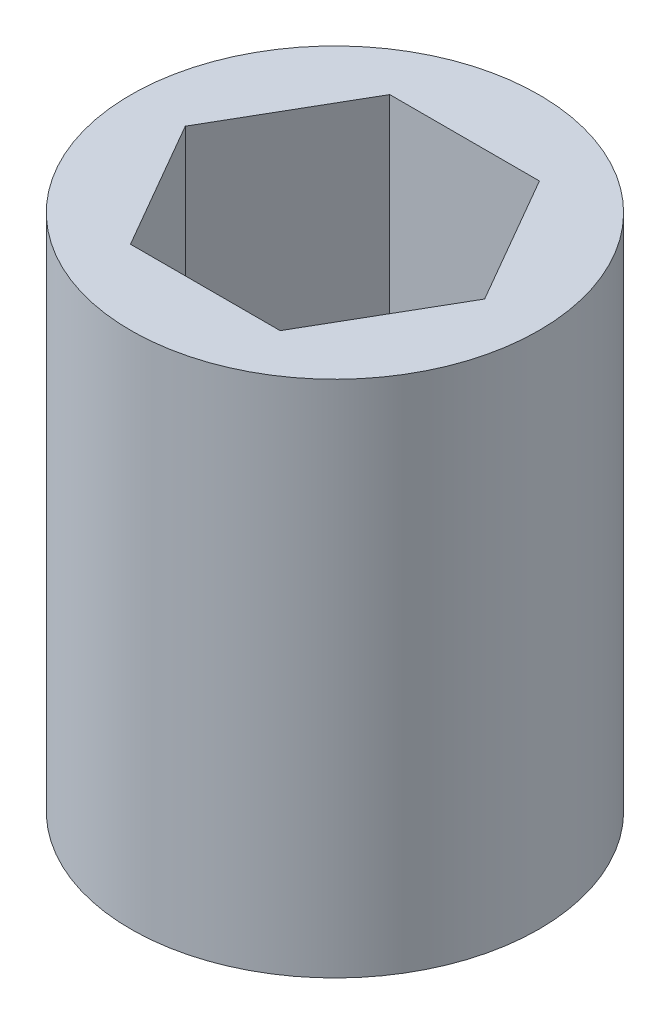
ISO-10303-21;
HEADER;
FILE_DESCRIPTION(('STEP AP214'),'2;1');
FILE_NAME('part.step','',(''),(''),'','','');
FILE_SCHEMA(('AUTOMOTIVE_DESIGN { 1 0 10303 214 1 1 1 1 }'));
ENDSEC;
DATA;
#1=APPLICATION_CONTEXT('core data for automotive mechanical design processes');
#2=APPLICATION_PROTOCOL_DEFINITION('international standard','automotive_design',2000,#1);
#3=PRODUCT_CONTEXT('',#1,'mechanical');
#4=PRODUCT('Part','Part','',(#3));
#5=PRODUCT_RELATED_PRODUCT_CATEGORY('part','',(#4));
#6=PRODUCT_DEFINITION_FORMATION('','',#4);
#7=PRODUCT_DEFINITION_CONTEXT('part definition',#1,'design');
#8=PRODUCT_DEFINITION('design','',#6,#7);
#9=PRODUCT_DEFINITION_SHAPE('','',#8);
#10=(LENGTH_UNIT() NAMED_UNIT(*) SI_UNIT(.MILLI.,.METRE.));
#11=(NAMED_UNIT(*) PLANE_ANGLE_UNIT() SI_UNIT($,.RADIAN.));
#12=(NAMED_UNIT(*) SI_UNIT($,.STERADIAN.) SOLID_ANGLE_UNIT());
#13=UNCERTAINTY_MEASURE_WITH_UNIT(LENGTH_MEASURE(1.E-05),#10,'distance_accuracy_value','');
#14=(GEOMETRIC_REPRESENTATION_CONTEXT(3) GLOBAL_UNCERTAINTY_ASSIGNED_CONTEXT((#13)) GLOBAL_UNIT_ASSIGNED_CONTEXT((#10,
#11,#12)) REPRESENTATION_CONTEXT('',''));
#15=CARTESIAN_POINT('',(0.,0.,0.));
#16=DIRECTION('',(0.,0.,1.));
#17=DIRECTION('',(1.,0.,0.));
#18=AXIS2_PLACEMENT_3D('',#15,#16,#17);
#19=CARTESIAN_POINT('',(-3.6661742093441,-25.39999999999,-6.35000000001));
#20=DIRECTION('',(0.,0.,1.));
#21=DIRECTION('',(0.,-1.,0.));
#22=AXIS2_PLACEMENT_3D('',#19,#20,#21);
#23=PLANE('',#22);
#24=DIRECTION('',(1.,0.,0.));
#25=VECTOR('',#24,1.);
#26=CARTESIAN_POINT('',(-3.66617420935409,0.,-6.35000000002));
#27=LINE('',#26,#25);
#28=CARTESIAN_POINT('',(-3.6661742093441,9.99894611553032E-12,-6.35000000001));
#29=VERTEX_POINT('',#28);
#30=CARTESIAN_POINT('',(3.6661742093642,9.99894611553032E-12,-6.35000000001));
#31=VERTEX_POINT('',#30);
#32=EDGE_CURVE('E101',#29,#31,#27,.T.);
#33=ORIENTED_EDGE('',*,*,#32,.F.);
#34=DIRECTION('',(0.,1.,0.));
#35=VECTOR('',#34,1.);
#36=CARTESIAN_POINT('',(-3.66617420935409,-25.4,-6.35000000002));
#37=LINE('',#36,#35);
#38=CARTESIAN_POINT('',(-3.6661742093441,-25.39999999999,-6.35000000001));
#39=VERTEX_POINT('',#38);
#40=EDGE_CURVE('E11',#39,#29,#37,.T.);
#41=ORIENTED_EDGE('',*,*,#40,.F.);
#42=DIRECTION('',(1.,0.,0.));
#43=VECTOR('',#42,1.);
#44=CARTESIAN_POINT('',(-3.66617420935409,-25.4,-6.35000000002));
#45=LINE('',#44,#43);
#46=CARTESIAN_POINT('',(3.6661742093642,-25.39999999999,-6.35000000001));
#47=VERTEX_POINT('',#46);
#48=EDGE_CURVE('E104',#39,#47,#45,.T.);
#49=ORIENTED_EDGE('',*,*,#48,.T.);
#50=DIRECTION('',(0.,1.,0.));
#51=VECTOR('',#50,1.);
#52=CARTESIAN_POINT('',(3.6661742093542,-25.4,-6.35000000002));
#53=LINE('',#52,#51);
#54=EDGE_CURVE('E80',#47,#31,#53,.T.);
#55=ORIENTED_EDGE('',*,*,#54,.T.);
#56=EDGE_LOOP('',(#33,#41,#49,#55));
#57=FACE_BOUND('',#56,.T.);
#58=ADVANCED_FACE('F17',(#57),#23,.T.);
#59=CARTESIAN_POINT('',(-7.3323484186982,-25.39999999999,-1.00006808390063E-11));
#60=DIRECTION('',(0.866025403784439,0.,0.5));
#61=DIRECTION('',(0.,-1.,0.));
#62=AXIS2_PLACEMENT_3D('',#59,#60,#61);
#63=PLANE('',#62);
#64=DIRECTION('',(0.5,0.,-0.866025403784438));
#65=VECTOR('',#64,1.);
#66=CARTESIAN_POINT('',(-7.33234841870819,0.,0.));
#67=LINE('',#66,#65);
#68=CARTESIAN_POINT('',(-7.3323484186982,9.99894611553032E-12,-1.00006808390063E-11));
#69=VERTEX_POINT('',#68);
#70=EDGE_CURVE('E126',#69,#29,#67,.T.);
#71=ORIENTED_EDGE('',*,*,#70,.F.);
#72=DIRECTION('',(0.,1.,0.));
#73=VECTOR('',#72,1.);
#74=CARTESIAN_POINT('',(-7.33234841870819,-25.4,0.));
#75=LINE('',#74,#73);
#76=CARTESIAN_POINT('',(-7.3323484186982,-25.39999999999,-1.00006808390063E-11));
#77=VERTEX_POINT('',#76);
#78=EDGE_CURVE('E26',#77,#69,#75,.T.);
#79=ORIENTED_EDGE('',*,*,#78,.F.);
#80=DIRECTION('',(0.5,0.,-0.866025403784438));
#81=VECTOR('',#80,1.);
#82=CARTESIAN_POINT('',(-7.33234841870819,-25.4,0.));
#83=LINE('',#82,#81);
#84=EDGE_CURVE('E108',#77,#39,#83,.T.);
#85=ORIENTED_EDGE('',*,*,#84,.T.);
#86=ORIENTED_EDGE('',*,*,#40,.T.);
#87=EDGE_LOOP('',(#71,#79,#85,#86));
#88=FACE_BOUND('',#87,.T.);
#89=ADVANCED_FACE('F164',(#88),#63,.T.);
#90=CARTESIAN_POINT('',(-3.6661742093441,-25.39999999999,6.34999999998999));
#91=DIRECTION('',(0.866025403784439,0.,-0.5));
#92=DIRECTION('',(0.,-1.,0.));
#93=AXIS2_PLACEMENT_3D('',#90,#91,#92);
#94=PLANE('',#93);
#95=DIRECTION('',(-0.5,0.,-0.866025403784438));
#96=VECTOR('',#95,1.);
#97=CARTESIAN_POINT('',(-3.66617420935409,0.,6.35));
#98=LINE('',#97,#96);
#99=CARTESIAN_POINT('',(-3.6661742093441,9.99894611553032E-12,6.34999999998999));
#100=VERTEX_POINT('',#99);
#101=EDGE_CURVE('E138',#100,#69,#98,.T.);
#102=ORIENTED_EDGE('',*,*,#101,.F.);
#103=DIRECTION('',(0.,1.,0.));
#104=VECTOR('',#103,1.);
#105=CARTESIAN_POINT('',(-3.66617420935409,-25.4,6.35));
#106=LINE('',#105,#104);
#107=CARTESIAN_POINT('',(-3.6661742093441,-25.39999999999,6.34999999998999));
#108=VERTEX_POINT('',#107);
#109=EDGE_CURVE('E155',#108,#100,#106,.T.);
#110=ORIENTED_EDGE('',*,*,#109,.F.);
#111=DIRECTION('',(-0.5,0.,-0.866025403784438));
#112=VECTOR('',#111,1.);
#113=CARTESIAN_POINT('',(-3.66617420935409,-25.4,6.35));
#114=LINE('',#113,#112);
#115=EDGE_CURVE('E130',#108,#77,#114,.T.);
#116=ORIENTED_EDGE('',*,*,#115,.T.);
#117=ORIENTED_EDGE('',*,*,#78,.T.);
#118=EDGE_LOOP('',(#102,#110,#116,#117));
#119=FACE_BOUND('',#118,.T.);
#120=ADVANCED_FACE('F162',(#119),#94,.T.);
#121=CARTESIAN_POINT('',(3.6661742093642,-25.39999999999,6.34999999998999));
#122=DIRECTION('',(0.,0.,-1.));
#123=DIRECTION('',(0.,-1.,0.));
#124=AXIS2_PLACEMENT_3D('',#121,#122,#123);
#125=PLANE('',#124);
#126=DIRECTION('',(-1.,0.,0.));
#127=VECTOR('',#126,1.);
#128=CARTESIAN_POINT('',(3.6661742093542,0.,6.35));
#129=LINE('',#128,#127);
#130=CARTESIAN_POINT('',(3.6661742093642,9.99894611553032E-12,6.34999999998999));
#131=VERTEX_POINT('',#130);
#132=EDGE_CURVE('E142',#131,#100,#129,.T.);
#133=ORIENTED_EDGE('',*,*,#132,.F.);
#134=DIRECTION('',(0.,1.,0.));
#135=VECTOR('',#134,1.);
#136=CARTESIAN_POINT('',(3.6661742093542,-25.4,6.35));
#137=LINE('',#136,#135);
#138=CARTESIAN_POINT('',(3.6661742093642,-25.39999999999,6.34999999998999));
#139=VERTEX_POINT('',#138);
#140=EDGE_CURVE('E152',#139,#131,#137,.T.);
#141=ORIENTED_EDGE('',*,*,#140,.F.);
#142=DIRECTION('',(-1.,0.,0.));
#143=VECTOR('',#142,1.);
#144=CARTESIAN_POINT('',(3.6661742093542,-25.4,6.35));
#145=LINE('',#144,#143);
#146=EDGE_CURVE('E134',#139,#108,#145,.T.);
#147=ORIENTED_EDGE('',*,*,#146,.T.);
#148=ORIENTED_EDGE('',*,*,#109,.T.);
#149=EDGE_LOOP('',(#133,#141,#147,#148));
#150=FACE_BOUND('',#149,.T.);
#151=ADVANCED_FACE('F170',(#150),#125,.T.);
#152=CARTESIAN_POINT('',(7.33234841871831,-25.39999999999,-1.00006808390063E-11));
#153=DIRECTION('',(-0.866025403784439,0.,-0.5));
#154=DIRECTION('',(-0.5,0.,0.866025403784439));
#155=AXIS2_PLACEMENT_3D('',#152,#153,#154);
#156=PLANE('',#155);
#157=DIRECTION('',(-0.5,0.,0.866025403784438));
#158=VECTOR('',#157,1.);
#159=CARTESIAN_POINT('',(7.3323484187083,0.,0.));
#160=LINE('',#159,#158);
#161=CARTESIAN_POINT('',(7.33234841871831,9.99894611553032E-12,-1.00006808390063E-11));
#162=VERTEX_POINT('',#161);
#163=EDGE_CURVE('E145',#162,#131,#160,.T.);
#164=ORIENTED_EDGE('',*,*,#163,.F.);
#165=DIRECTION('',(0.,1.,0.));
#166=VECTOR('',#165,1.);
#167=CARTESIAN_POINT('',(7.3323484187083,-25.4,0.));
#168=LINE('',#167,#166);
#169=CARTESIAN_POINT('',(7.33234841871831,-25.39999999999,-1.00006808390063E-11));
#170=VERTEX_POINT('',#169);
#171=EDGE_CURVE('E66',#170,#162,#168,.T.);
#172=ORIENTED_EDGE('',*,*,#171,.F.);
#173=DIRECTION('',(-0.5,0.,0.866025403784438));
#174=VECTOR('',#173,1.);
#175=CARTESIAN_POINT('',(7.3323484187083,-25.4,0.));
#176=LINE('',#175,#174);
#177=EDGE_CURVE('E114',#170,#139,#176,.T.);
#178=ORIENTED_EDGE('',*,*,#177,.T.);
#179=ORIENTED_EDGE('',*,*,#140,.T.);
#180=EDGE_LOOP('',(#164,#172,#178,#179));
#181=FACE_BOUND('',#180,.T.);
#182=ADVANCED_FACE('F208',(#181),#156,.T.);
#183=CARTESIAN_POINT('',(3.6661742093642,-25.39999999999,-6.35000000001));
#184=DIRECTION('',(-0.866025403784439,0.,0.5));
#185=DIRECTION('',(0.,1.,0.));
#186=AXIS2_PLACEMENT_3D('',#183,#184,#185);
#187=PLANE('',#186);
#188=DIRECTION('',(0.5,0.,0.866025403784438));
#189=VECTOR('',#188,1.);
#190=CARTESIAN_POINT('',(3.6661742093542,0.,-6.35000000002));
#191=LINE('',#190,#189);
#192=EDGE_CURVE('E99',#31,#162,#191,.T.);
#193=ORIENTED_EDGE('',*,*,#192,.F.);
#194=ORIENTED_EDGE('',*,*,#54,.F.);
#195=DIRECTION('',(0.5,0.,0.866025403784438));
#196=VECTOR('',#195,1.);
#197=CARTESIAN_POINT('',(3.6661742093542,-25.4,-6.35000000002));
#198=LINE('',#197,#196);
#199=EDGE_CURVE('E96',#47,#170,#198,.T.);
#200=ORIENTED_EDGE('',*,*,#199,.T.);
#201=ORIENTED_EDGE('',*,*,#171,.T.);
#202=EDGE_LOOP('',(#193,#194,#200,#201));
#203=FACE_BOUND('',#202,.T.);
#204=ADVANCED_FACE('F94',(#203),#187,.T.);
#205=CARTESIAN_POINT('',(9.99894611553032E-12,-25.39999999999,-1.00006808390063E-11));
#206=DIRECTION('',(0.,1.,0.));
#207=DIRECTION('',(-1.,0.,0.));
#208=AXIS2_PLACEMENT_3D('',#205,#206,#207);
#209=CYLINDRICAL_SURFACE('',#208,10.);
#210=CARTESIAN_POINT('',(0.,-25.4,0.));
#211=DIRECTION('',(0.,-1.,0.));
#212=DIRECTION('',(1.,0.,0.));
#213=AXIS2_PLACEMENT_3D('',#210,#211,#212);
#214=CIRCLE('',#213,10.00000000001);
#215=CARTESIAN_POINT('',(10.00000000001,-25.4,0.));
#216=VERTEX_POINT('',#215);
#217=EDGE_CURVE('E121',#216,#216,#214,.T.);
#218=ORIENTED_EDGE('',*,*,#217,.F.);
#219=EDGE_LOOP('',(#218));
#220=FACE_BOUND('',#219,.T.);
#221=CARTESIAN_POINT('',(0.,0.,0.));
#222=DIRECTION('',(0.,-1.,0.));
#223=DIRECTION('',(1.,0.,0.));
#224=AXIS2_PLACEMENT_3D('',#221,#222,#223);
#225=CIRCLE('',#224,10.00000000001);
#226=CARTESIAN_POINT('',(10.00000000001,0.,0.));
#227=VERTEX_POINT('',#226);
#228=EDGE_CURVE('E125',#227,#227,#225,.T.);
#229=ORIENTED_EDGE('',*,*,#228,.T.);
#230=EDGE_LOOP('',(#229));
#231=FACE_BOUND('',#230,.T.);
#232=ADVANCED_FACE('F184',(#220,#231),#209,.T.);
#233=CARTESIAN_POINT('',(9.99894611553032E-12,9.99894611553032E-12,-1.00006808390063E-11));
#234=DIRECTION('',(0.,-1.,0.));
#235=DIRECTION('',(0.,0.,-1.));
#236=AXIS2_PLACEMENT_3D('',#233,#234,#235);
#237=PLANE('',#236);
#238=ORIENTED_EDGE('',*,*,#192,.T.);
#239=ORIENTED_EDGE('',*,*,#163,.T.);
#240=ORIENTED_EDGE('',*,*,#132,.T.);
#241=ORIENTED_EDGE('',*,*,#101,.T.);
#242=ORIENTED_EDGE('',*,*,#70,.T.);
#243=ORIENTED_EDGE('',*,*,#32,.T.);
#244=EDGE_LOOP('',(#238,#239,#240,#241,#242,#243));
#245=FACE_BOUND('',#244,.T.);
#246=ORIENTED_EDGE('',*,*,#228,.F.);
#247=EDGE_LOOP('',(#246));
#248=FACE_BOUND('',#247,.T.);
#249=ADVANCED_FACE('F166',(#245,#248),#237,.F.);
#250=CARTESIAN_POINT('',(9.99894611553032E-12,-25.39999999999,-1.00006808390063E-11));
#251=DIRECTION('',(0.,-1.,0.));
#252=DIRECTION('',(0.,0.,-1.));
#253=AXIS2_PLACEMENT_3D('',#250,#251,#252);
#254=PLANE('',#253);
#255=ORIENTED_EDGE('',*,*,#177,.F.);
#256=ORIENTED_EDGE('',*,*,#199,.F.);
#257=ORIENTED_EDGE('',*,*,#48,.F.);
#258=ORIENTED_EDGE('',*,*,#84,.F.);
#259=ORIENTED_EDGE('',*,*,#115,.F.);
#260=ORIENTED_EDGE('',*,*,#146,.F.);
#261=EDGE_LOOP('',(#255,#256,#257,#258,#259,#260));
#262=FACE_BOUND('',#261,.T.);
#263=ORIENTED_EDGE('',*,*,#217,.T.);
#264=EDGE_LOOP('',(#263));
#265=FACE_BOUND('',#264,.T.);
#266=ADVANCED_FACE('F110',(#262,#265),#254,.T.);
#267=CLOSED_SHELL('',(#58,#89,#120,#151,#182,#204,#232,#249,#266));
#268=MANIFOLD_SOLID_BREP('B1',#267);
#269=ADVANCED_BREP_SHAPE_REPRESENTATION('',(#18,#268),#14);
#270=SHAPE_DEFINITION_REPRESENTATION(#9,#269);
ENDSEC;
END-ISO-10303-21;
